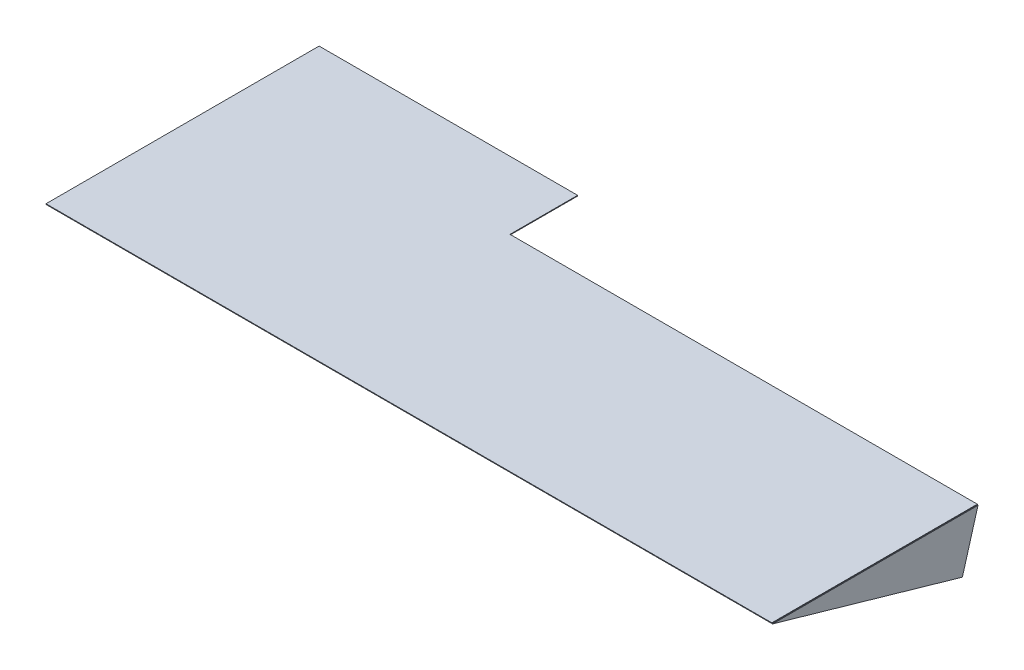
ISO-10303-21;
HEADER;
FILE_DESCRIPTION(('STEP AP214'),'2;1');
FILE_NAME('part.step','',(''),(''),'','','');
FILE_SCHEMA(('AUTOMOTIVE_DESIGN { 1 0 10303 214 1 1 1 1 }'));
ENDSEC;
DATA;
#1=APPLICATION_CONTEXT('core data for automotive mechanical design processes');
#2=APPLICATION_PROTOCOL_DEFINITION('international standard','automotive_design',2000,#1);
#3=PRODUCT_CONTEXT('',#1,'mechanical');
#4=PRODUCT('Part','Part','',(#3));
#5=PRODUCT_RELATED_PRODUCT_CATEGORY('part','',(#4));
#6=PRODUCT_DEFINITION_FORMATION('','',#4);
#7=PRODUCT_DEFINITION_CONTEXT('part definition',#1,'design');
#8=PRODUCT_DEFINITION('design','',#6,#7);
#9=PRODUCT_DEFINITION_SHAPE('','',#8);
#10=(LENGTH_UNIT() NAMED_UNIT(*) SI_UNIT(.MILLI.,.METRE.));
#11=(NAMED_UNIT(*) PLANE_ANGLE_UNIT() SI_UNIT($,.RADIAN.));
#12=(NAMED_UNIT(*) SI_UNIT($,.STERADIAN.) SOLID_ANGLE_UNIT());
#13=UNCERTAINTY_MEASURE_WITH_UNIT(LENGTH_MEASURE(1.E-05),#10,'distance_accuracy_value','');
#14=(GEOMETRIC_REPRESENTATION_CONTEXT(3) GLOBAL_UNCERTAINTY_ASSIGNED_CONTEXT((#13)) GLOBAL_UNIT_ASSIGNED_CONTEXT((#10,
#11,#12)) REPRESENTATION_CONTEXT('',''));
#15=CARTESIAN_POINT('',(0.,0.,0.));
#16=DIRECTION('',(0.,0.,1.));
#17=DIRECTION('',(1.,0.,0.));
#18=AXIS2_PLACEMENT_3D('',#15,#16,#17);
#19=CARTESIAN_POINT('',(10960.,0.,0.));
#20=DIRECTION('',(0.,-1.,0.));
#21=DIRECTION('',(0.,0.,-1.));
#22=AXIS2_PLACEMENT_3D('',#19,#20,#21);
#23=PLANE('',#22);
#24=DIRECTION('',(0.,0.,1.));
#25=VECTOR('',#24,1.);
#26=CARTESIAN_POINT('',(10950.,0.,0.));
#27=LINE('',#26,#25);
#28=CARTESIAN_POINT('',(10950.,0.,-3100.));
#29=VERTEX_POINT('',#28);
#30=CARTESIAN_POINT('',(10950.,0.,0.));
#31=VERTEX_POINT('',#30);
#32=EDGE_CURVE('E94',#29,#31,#27,.T.);
#33=ORIENTED_EDGE('',*,*,#32,.T.);
#34=DIRECTION('',(-1.,0.,0.));
#35=VECTOR('',#34,1.);
#36=CARTESIAN_POINT('',(10960.,0.,0.));
#37=LINE('',#36,#35);
#38=CARTESIAN_POINT('',(10960.,0.,0.));
#39=VERTEX_POINT('',#38);
#40=EDGE_CURVE('E12',#39,#31,#37,.T.);
#41=ORIENTED_EDGE('',*,*,#40,.F.);
#42=DIRECTION('',(0.,0.,1.));
#43=VECTOR('',#42,1.);
#44=CARTESIAN_POINT('',(10960.,0.,0.));
#45=LINE('',#44,#43);
#46=CARTESIAN_POINT('',(10960.,0.,-3100.));
#47=VERTEX_POINT('',#46);
#48=EDGE_CURVE('E87',#47,#39,#45,.T.);
#49=ORIENTED_EDGE('',*,*,#48,.F.);
#50=DIRECTION('',(-1.,0.,0.));
#51=VECTOR('',#50,1.);
#52=CARTESIAN_POINT('',(10960.,0.,-3100.));
#53=LINE('',#52,#51);
#54=EDGE_CURVE('E95',#47,#29,#53,.T.);
#55=ORIENTED_EDGE('',*,*,#54,.T.);
#56=EDGE_LOOP('',(#33,#41,#49,#55));
#57=FACE_BOUND('',#56,.T.);
#58=ADVANCED_FACE('F47',(#57),#23,.F.);
#59=CARTESIAN_POINT('',(10960.,0.,0.));
#60=DIRECTION('',(0.,0.961261695938319,-0.275637355816999));
#61=DIRECTION('',(0.,0.275637355816999,0.961261695938319));
#62=AXIS2_PLACEMENT_3D('',#59,#60,#61);
#63=PLANE('',#62);
#64=DIRECTION('',(0.,-0.275637355816999,-0.961261695938319));
#65=VECTOR('',#64,1.);
#66=CARTESIAN_POINT('',(10950.,0.,0.));
#67=LINE('',#66,#65);
#68=CARTESIAN_POINT('',(10950.,-821.374859561466,-2864.47454904246));
#69=VERTEX_POINT('',#68);
#70=EDGE_CURVE('E75',#31,#69,#67,.T.);
#71=ORIENTED_EDGE('',*,*,#70,.T.);
#72=DIRECTION('',(-1.,0.,0.));
#73=VECTOR('',#72,1.);
#74=CARTESIAN_POINT('',(10960.,-821.374859561466,-2864.47454904246));
#75=LINE('',#74,#73);
#76=CARTESIAN_POINT('',(10960.,-821.374859561466,-2864.47454904246));
#77=VERTEX_POINT('',#76);
#78=EDGE_CURVE('E55',#77,#69,#75,.T.);
#79=ORIENTED_EDGE('',*,*,#78,.F.);
#80=DIRECTION('',(0.,-0.275637355816999,-0.961261695938319));
#81=VECTOR('',#80,1.);
#82=CARTESIAN_POINT('',(10960.,0.,0.));
#83=LINE('',#82,#81);
#84=EDGE_CURVE('E83',#39,#77,#83,.T.);
#85=ORIENTED_EDGE('',*,*,#84,.F.);
#86=ORIENTED_EDGE('',*,*,#40,.T.);
#87=EDGE_LOOP('',(#71,#79,#85,#86));
#88=FACE_BOUND('',#87,.T.);
#89=ADVANCED_FACE('F84',(#88),#63,.F.);
#90=CARTESIAN_POINT('',(10960.,-821.374859561466,-2864.47454904246));
#91=DIRECTION('',(0.,0.275637355817,0.961261695938319));
#92=DIRECTION('',(0.,-0.961261695938319,0.275637355817));
#93=AXIS2_PLACEMENT_3D('',#90,#91,#92);
#94=PLANE('',#93);
#95=DIRECTION('',(0.,0.961261695938319,-0.275637355817));
#96=VECTOR('',#95,1.);
#97=CARTESIAN_POINT('',(10950.,-821.374859561466,-2864.47454904246));
#98=LINE('',#97,#96);
#99=EDGE_CURVE('E80',#69,#29,#98,.T.);
#100=ORIENTED_EDGE('',*,*,#99,.T.);
#101=ORIENTED_EDGE('',*,*,#54,.F.);
#102=DIRECTION('',(0.,0.961261695938319,-0.275637355817));
#103=VECTOR('',#102,1.);
#104=CARTESIAN_POINT('',(10960.,-821.374859561466,-2864.47454904246));
#105=LINE('',#104,#103);
#106=EDGE_CURVE('E63',#77,#47,#105,.T.);
#107=ORIENTED_EDGE('',*,*,#106,.F.);
#108=ORIENTED_EDGE('',*,*,#78,.T.);
#109=EDGE_LOOP('',(#100,#101,#107,#108));
#110=FACE_BOUND('',#109,.T.);
#111=ADVANCED_FACE('F102',(#110),#94,.F.);
#112=CARTESIAN_POINT('',(10960.,-3.5983969628338E-12,-1.25605619095656E-11));
#113=DIRECTION('',(1.,0.,0.));
#114=DIRECTION('',(0.,0.,-1.));
#115=AXIS2_PLACEMENT_3D('',#112,#113,#114);
#116=PLANE('',#115);
#117=ORIENTED_EDGE('',*,*,#48,.T.);
#118=ORIENTED_EDGE('',*,*,#84,.T.);
#119=ORIENTED_EDGE('',*,*,#106,.T.);
#120=EDGE_LOOP('',(#117,#118,#119));
#121=FACE_BOUND('',#120,.T.);
#122=ADVANCED_FACE('F90',(#121),#116,.T.);
#123=CARTESIAN_POINT('',(10950.,-3.5983969628338E-12,-1.25491015428598E-11));
#124=DIRECTION('',(1.,0.,0.));
#125=DIRECTION('',(0.,0.,-1.));
#126=AXIS2_PLACEMENT_3D('',#123,#124,#125);
#127=PLANE('',#126);
#128=ORIENTED_EDGE('',*,*,#32,.F.);
#129=ORIENTED_EDGE('',*,*,#99,.F.);
#130=ORIENTED_EDGE('',*,*,#70,.F.);
#131=EDGE_LOOP('',(#128,#129,#130));
#132=FACE_BOUND('',#131,.T.);
#133=ADVANCED_FACE('F103',(#132),#127,.F.);
#134=CLOSED_SHELL('',(#58,#89,#111,#122,#133));
#135=MANIFOLD_SOLID_BREP('B2',#134);
#136=CARTESIAN_POINT('',(0.,10.,0.));
#137=DIRECTION('',(1.,0.,0.));
#138=DIRECTION('',(0.,0.,-1.));
#139=AXIS2_PLACEMENT_3D('',#136,#137,#138);
#140=PLANE('',#139);
#141=DIRECTION('',(0.,0.,1.));
#142=VECTOR('',#141,1.);
#143=CARTESIAN_POINT('',(0.,0.,0.));
#144=LINE('',#143,#142);
#145=CARTESIAN_POINT('',(0.,0.,-4120.));
#146=VERTEX_POINT('',#145);
#147=CARTESIAN_POINT('',(0.,0.,0.));
#148=VERTEX_POINT('',#147);
#149=EDGE_CURVE('E229',#146,#148,#144,.T.);
#150=ORIENTED_EDGE('',*,*,#149,.T.);
#151=DIRECTION('',(0.,-1.,0.));
#152=VECTOR('',#151,1.);
#153=CARTESIAN_POINT('',(0.,10.,0.));
#154=LINE('',#153,#152);
#155=CARTESIAN_POINT('',(0.,10.,0.));
#156=VERTEX_POINT('',#155);
#157=EDGE_CURVE('E45',#156,#148,#154,.T.);
#158=ORIENTED_EDGE('',*,*,#157,.F.);
#159=DIRECTION('',(0.,0.,1.));
#160=VECTOR('',#159,1.);
#161=CARTESIAN_POINT('',(0.,10.,0.));
#162=LINE('',#161,#160);
#163=CARTESIAN_POINT('',(0.,10.,-4120.));
#164=VERTEX_POINT('',#163);
#165=EDGE_CURVE('E239',#164,#156,#162,.T.);
#166=ORIENTED_EDGE('',*,*,#165,.F.);
#167=DIRECTION('',(0.,-1.,0.));
#168=VECTOR('',#167,1.);
#169=CARTESIAN_POINT('',(0.,10.,-4120.));
#170=LINE('',#169,#168);
#171=EDGE_CURVE('E225',#164,#146,#170,.T.);
#172=ORIENTED_EDGE('',*,*,#171,.T.);
#173=EDGE_LOOP('',(#150,#158,#166,#172));
#174=FACE_BOUND('',#173,.T.);
#175=ADVANCED_FACE('F145',(#174),#140,.F.);
#176=CARTESIAN_POINT('',(0.,10.,0.));
#177=DIRECTION('',(0.,0.,-1.));
#178=DIRECTION('',(-1.,0.,0.));
#179=AXIS2_PLACEMENT_3D('',#176,#177,#178);
#180=PLANE('',#179);
#181=DIRECTION('',(1.,0.,0.));
#182=VECTOR('',#181,1.);
#183=CARTESIAN_POINT('',(0.,0.,0.));
#184=LINE('',#183,#182);
#185=CARTESIAN_POINT('',(10950.,0.,0.));
#186=VERTEX_POINT('',#185);
#187=EDGE_CURVE('E232',#148,#186,#184,.T.);
#188=ORIENTED_EDGE('',*,*,#187,.T.);
#189=DIRECTION('',(0.,-1.,0.));
#190=VECTOR('',#189,1.);
#191=CARTESIAN_POINT('',(10950.,10.,0.));
#192=LINE('',#191,#190);
#193=CARTESIAN_POINT('',(10950.,10.,0.));
#194=VERTEX_POINT('',#193);
#195=EDGE_CURVE('E153',#194,#186,#192,.T.);
#196=ORIENTED_EDGE('',*,*,#195,.F.);
#197=DIRECTION('',(1.,0.,0.));
#198=VECTOR('',#197,1.);
#199=CARTESIAN_POINT('',(0.,10.,0.));
#200=LINE('',#199,#198);
#201=EDGE_CURVE('E198',#156,#194,#200,.T.);
#202=ORIENTED_EDGE('',*,*,#201,.F.);
#203=ORIENTED_EDGE('',*,*,#157,.T.);
#204=EDGE_LOOP('',(#188,#196,#202,#203));
#205=FACE_BOUND('',#204,.T.);
#206=ADVANCED_FACE('F263',(#205),#180,.F.);
#207=CARTESIAN_POINT('',(10950.,10.,0.));
#208=DIRECTION('',(-1.,0.,0.));
#209=DIRECTION('',(0.,0.,1.));
#210=AXIS2_PLACEMENT_3D('',#207,#208,#209);
#211=PLANE('',#210);
#212=DIRECTION('',(0.,0.,-1.));
#213=VECTOR('',#212,1.);
#214=CARTESIAN_POINT('',(10950.,0.,0.));
#215=LINE('',#214,#213);
#216=CARTESIAN_POINT('',(10950.,0.,-3100.));
#217=VERTEX_POINT('',#216);
#218=EDGE_CURVE('E234',#186,#217,#215,.T.);
#219=ORIENTED_EDGE('',*,*,#218,.T.);
#220=DIRECTION('',(0.,-1.,0.));
#221=VECTOR('',#220,1.);
#222=CARTESIAN_POINT('',(10950.,10.,-3100.));
#223=LINE('',#222,#221);
#224=CARTESIAN_POINT('',(10950.,10.,-3100.));
#225=VERTEX_POINT('',#224);
#226=EDGE_CURVE('E220',#225,#217,#223,.T.);
#227=ORIENTED_EDGE('',*,*,#226,.F.);
#228=DIRECTION('',(0.,0.,-1.));
#229=VECTOR('',#228,1.);
#230=CARTESIAN_POINT('',(10950.,10.,0.));
#231=LINE('',#230,#229);
#232=EDGE_CURVE('E211',#194,#225,#231,.T.);
#233=ORIENTED_EDGE('',*,*,#232,.F.);
#234=ORIENTED_EDGE('',*,*,#195,.T.);
#235=EDGE_LOOP('',(#219,#227,#233,#234));
#236=FACE_BOUND('',#235,.T.);
#237=ADVANCED_FACE('F245',(#236),#211,.F.);
#238=CARTESIAN_POINT('',(3900.,10.,-3100.));
#239=DIRECTION('',(0.,0.,1.));
#240=DIRECTION('',(1.,0.,0.));
#241=AXIS2_PLACEMENT_3D('',#238,#239,#240);
#242=PLANE('',#241);
#243=DIRECTION('',(-1.,0.,0.));
#244=VECTOR('',#243,1.);
#245=CARTESIAN_POINT('',(3900.,0.,-3100.));
#246=LINE('',#245,#244);
#247=CARTESIAN_POINT('',(3900.,0.,-3100.));
#248=VERTEX_POINT('',#247);
#249=EDGE_CURVE('E219',#217,#248,#246,.T.);
#250=ORIENTED_EDGE('',*,*,#249,.T.);
#251=DIRECTION('',(0.,-1.,0.));
#252=VECTOR('',#251,1.);
#253=CARTESIAN_POINT('',(3900.,10.,-3100.));
#254=LINE('',#253,#252);
#255=CARTESIAN_POINT('',(3900.,10.,-3100.));
#256=VERTEX_POINT('',#255);
#257=EDGE_CURVE('E216',#256,#248,#254,.T.);
#258=ORIENTED_EDGE('',*,*,#257,.F.);
#259=DIRECTION('',(-1.,0.,0.));
#260=VECTOR('',#259,1.);
#261=CARTESIAN_POINT('',(3900.,10.,-3100.));
#262=LINE('',#261,#260);
#263=EDGE_CURVE('E205',#225,#256,#262,.T.);
#264=ORIENTED_EDGE('',*,*,#263,.F.);
#265=ORIENTED_EDGE('',*,*,#226,.T.);
#266=EDGE_LOOP('',(#250,#258,#264,#265));
#267=FACE_BOUND('',#266,.T.);
#268=ADVANCED_FACE('F217',(#267),#242,.F.);
#269=CARTESIAN_POINT('',(3900.,10.,-3100.));
#270=DIRECTION('',(-1.,0.,0.));
#271=DIRECTION('',(0.,0.,1.));
#272=AXIS2_PLACEMENT_3D('',#269,#270,#271);
#273=PLANE('',#272);
#274=DIRECTION('',(0.,0.,-1.));
#275=VECTOR('',#274,1.);
#276=CARTESIAN_POINT('',(3900.,0.,-3100.));
#277=LINE('',#276,#275);
#278=CARTESIAN_POINT('',(3900.,0.,-4120.));
#279=VERTEX_POINT('',#278);
#280=EDGE_CURVE('E184',#248,#279,#277,.T.);
#281=ORIENTED_EDGE('',*,*,#280,.T.);
#282=DIRECTION('',(0.,-1.,0.));
#283=VECTOR('',#282,1.);
#284=CARTESIAN_POINT('',(3900.,10.,-4120.));
#285=LINE('',#284,#283);
#286=CARTESIAN_POINT('',(3900.,10.,-4120.));
#287=VERTEX_POINT('',#286);
#288=EDGE_CURVE('E221',#287,#279,#285,.T.);
#289=ORIENTED_EDGE('',*,*,#288,.F.);
#290=DIRECTION('',(0.,0.,-1.));
#291=VECTOR('',#290,1.);
#292=CARTESIAN_POINT('',(3900.,10.,-3100.));
#293=LINE('',#292,#291);
#294=EDGE_CURVE('E209',#256,#287,#293,.T.);
#295=ORIENTED_EDGE('',*,*,#294,.F.);
#296=ORIENTED_EDGE('',*,*,#257,.T.);
#297=EDGE_LOOP('',(#281,#289,#295,#296));
#298=FACE_BOUND('',#297,.T.);
#299=ADVANCED_FACE('F223',(#298),#273,.F.);
#300=CARTESIAN_POINT('',(3900.,10.,-4120.));
#301=DIRECTION('',(0.,0.,1.));
#302=DIRECTION('',(1.,0.,0.));
#303=AXIS2_PLACEMENT_3D('',#300,#301,#302);
#304=PLANE('',#303);
#305=DIRECTION('',(-1.,0.,0.));
#306=VECTOR('',#305,1.);
#307=CARTESIAN_POINT('',(3900.,0.,-4120.));
#308=LINE('',#307,#306);
#309=EDGE_CURVE('E190',#279,#146,#308,.T.);
#310=ORIENTED_EDGE('',*,*,#309,.T.);
#311=ORIENTED_EDGE('',*,*,#171,.F.);
#312=DIRECTION('',(-1.,0.,0.));
#313=VECTOR('',#312,1.);
#314=CARTESIAN_POINT('',(3900.,10.,-4120.));
#315=LINE('',#314,#313);
#316=EDGE_CURVE('E161',#287,#164,#315,.T.);
#317=ORIENTED_EDGE('',*,*,#316,.F.);
#318=ORIENTED_EDGE('',*,*,#288,.T.);
#319=EDGE_LOOP('',(#310,#311,#317,#318));
#320=FACE_BOUND('',#319,.T.);
#321=ADVANCED_FACE('F252',(#320),#304,.F.);
#322=CARTESIAN_POINT('',(0.,10.,0.));
#323=DIRECTION('',(0.,1.,0.));
#324=DIRECTION('',(0.,0.,1.));
#325=AXIS2_PLACEMENT_3D('',#322,#323,#324);
#326=PLANE('',#325);
#327=ORIENTED_EDGE('',*,*,#165,.T.);
#328=ORIENTED_EDGE('',*,*,#201,.T.);
#329=ORIENTED_EDGE('',*,*,#232,.T.);
#330=ORIENTED_EDGE('',*,*,#263,.T.);
#331=ORIENTED_EDGE('',*,*,#294,.T.);
#332=ORIENTED_EDGE('',*,*,#316,.T.);
#333=EDGE_LOOP('',(#327,#328,#329,#330,#331,#332));
#334=FACE_BOUND('',#333,.T.);
#335=ADVANCED_FACE('F207',(#334),#326,.T.);
#336=CARTESIAN_POINT('',(0.,0.,0.));
#337=DIRECTION('',(0.,1.,0.));
#338=DIRECTION('',(0.,0.,1.));
#339=AXIS2_PLACEMENT_3D('',#336,#337,#338);
#340=PLANE('',#339);
#341=ORIENTED_EDGE('',*,*,#149,.F.);
#342=ORIENTED_EDGE('',*,*,#309,.F.);
#343=ORIENTED_EDGE('',*,*,#280,.F.);
#344=ORIENTED_EDGE('',*,*,#249,.F.);
#345=ORIENTED_EDGE('',*,*,#218,.F.);
#346=ORIENTED_EDGE('',*,*,#187,.F.);
#347=EDGE_LOOP('',(#341,#342,#343,#344,#345,#346));
#348=FACE_BOUND('',#347,.T.);
#349=ADVANCED_FACE('F248',(#348),#340,.F.);
#350=CLOSED_SHELL('',(#175,#206,#237,#268,#299,#321,#335,#349));
#351=MANIFOLD_SOLID_BREP('B6',#350);
#352=ADVANCED_BREP_SHAPE_REPRESENTATION('',(#18,#135,#351),#14);
#353=SHAPE_DEFINITION_REPRESENTATION(#9,#352);
ENDSEC;
END-ISO-10303-21;
